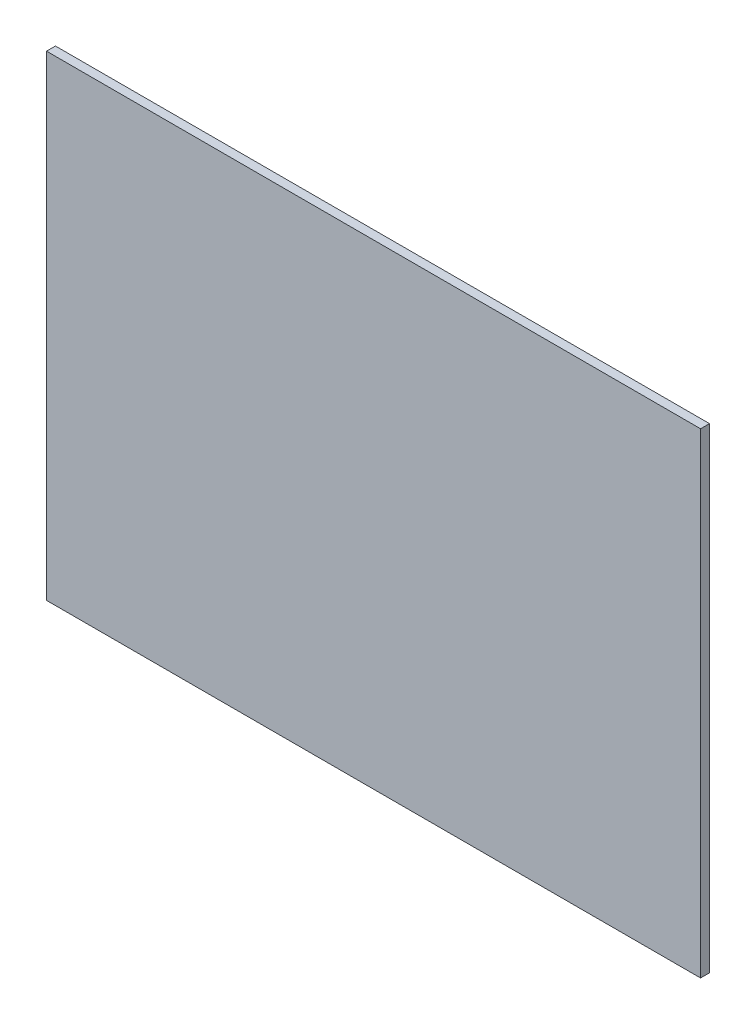
ISO-10303-21;
HEADER;
FILE_DESCRIPTION(('STEP AP214'),'2;1');
FILE_NAME('part.step','',(''),(''),'','','');
FILE_SCHEMA(('AUTOMOTIVE_DESIGN { 1 0 10303 214 1 1 1 1 }'));
ENDSEC;
DATA;
#1=APPLICATION_CONTEXT('core data for automotive mechanical design processes');
#2=APPLICATION_PROTOCOL_DEFINITION('international standard','automotive_design',2000,#1);
#3=PRODUCT_CONTEXT('',#1,'mechanical');
#4=PRODUCT('Part','Part','',(#3));
#5=PRODUCT_RELATED_PRODUCT_CATEGORY('part','',(#4));
#6=PRODUCT_DEFINITION_FORMATION('','',#4);
#7=PRODUCT_DEFINITION_CONTEXT('part definition',#1,'design');
#8=PRODUCT_DEFINITION('design','',#6,#7);
#9=PRODUCT_DEFINITION_SHAPE('','',#8);
#10=(LENGTH_UNIT() NAMED_UNIT(*) SI_UNIT(.MILLI.,.METRE.));
#11=(NAMED_UNIT(*) PLANE_ANGLE_UNIT() SI_UNIT($,.RADIAN.));
#12=(NAMED_UNIT(*) SI_UNIT($,.STERADIAN.) SOLID_ANGLE_UNIT());
#13=UNCERTAINTY_MEASURE_WITH_UNIT(LENGTH_MEASURE(1.E-05),#10,'distance_accuracy_value','');
#14=(GEOMETRIC_REPRESENTATION_CONTEXT(3) GLOBAL_UNCERTAINTY_ASSIGNED_CONTEXT((#13)) GLOBAL_UNIT_ASSIGNED_CONTEXT((#10,
#11,#12)) REPRESENTATION_CONTEXT('',''));
#15=CARTESIAN_POINT('',(0.,0.,0.));
#16=DIRECTION('',(0.,0.,1.));
#17=DIRECTION('',(1.,0.,0.));
#18=AXIS2_PLACEMENT_3D('',#15,#16,#17);
#19=CARTESIAN_POINT('',(0.,0.,1.5));
#20=DIRECTION('',(-1.,0.,0.));
#21=DIRECTION('',(0.,0.,1.));
#22=AXIS2_PLACEMENT_3D('',#19,#20,#21);
#23=PLANE('',#22);
#24=DIRECTION('',(0.,1.,0.));
#25=VECTOR('',#24,1.);
#26=CARTESIAN_POINT('',(0.,0.,0.));
#27=LINE('',#26,#25);
#28=CARTESIAN_POINT('',(0.,0.,0.));
#29=VERTEX_POINT('',#28);
#30=CARTESIAN_POINT('',(0.,80.,0.));
#31=VERTEX_POINT('',#30);
#32=EDGE_CURVE('E96',#29,#31,#27,.T.);
#33=ORIENTED_EDGE('',*,*,#32,.T.);
#34=DIRECTION('',(0.,0.,-1.));
#35=VECTOR('',#34,1.);
#36=CARTESIAN_POINT('',(0.,80.,1.5));
#37=LINE('',#36,#35);
#38=CARTESIAN_POINT('',(0.,80.,1.5));
#39=VERTEX_POINT('',#38);
#40=EDGE_CURVE('E11',#39,#31,#37,.T.);
#41=ORIENTED_EDGE('',*,*,#40,.F.);
#42=DIRECTION('',(0.,1.,0.));
#43=VECTOR('',#42,1.);
#44=CARTESIAN_POINT('',(0.,0.,1.5));
#45=LINE('',#44,#43);
#46=CARTESIAN_POINT('',(0.,0.,1.5));
#47=VERTEX_POINT('',#46);
#48=EDGE_CURVE('E84',#47,#39,#45,.T.);
#49=ORIENTED_EDGE('',*,*,#48,.F.);
#50=DIRECTION('',(0.,0.,-1.));
#51=VECTOR('',#50,1.);
#52=CARTESIAN_POINT('',(0.,0.,1.5));
#53=LINE('',#52,#51);
#54=EDGE_CURVE('E92',#47,#29,#53,.T.);
#55=ORIENTED_EDGE('',*,*,#54,.T.);
#56=EDGE_LOOP('',(#33,#41,#49,#55));
#57=FACE_BOUND('',#56,.T.);
#58=ADVANCED_FACE('F33',(#57),#23,.F.);
#59=CARTESIAN_POINT('',(0.,80.,1.5));
#60=DIRECTION('',(0.,-1.,0.));
#61=DIRECTION('',(1.,0.,0.));
#62=AXIS2_PLACEMENT_3D('',#59,#60,#61);
#63=PLANE('',#62);
#64=DIRECTION('',(-1.,0.,0.));
#65=VECTOR('',#64,1.);
#66=CARTESIAN_POINT('',(0.,80.,0.));
#67=LINE('',#66,#65);
#68=CARTESIAN_POINT('',(-110.,80.,0.));
#69=VERTEX_POINT('',#68);
#70=EDGE_CURVE('E88',#31,#69,#67,.T.);
#71=ORIENTED_EDGE('',*,*,#70,.T.);
#72=DIRECTION('',(0.,0.,-1.));
#73=VECTOR('',#72,1.);
#74=CARTESIAN_POINT('',(-110.,80.,1.5));
#75=LINE('',#74,#73);
#76=CARTESIAN_POINT('',(-110.,80.,1.5));
#77=VERTEX_POINT('',#76);
#78=EDGE_CURVE('E41',#77,#69,#75,.T.);
#79=ORIENTED_EDGE('',*,*,#78,.F.);
#80=DIRECTION('',(-1.,0.,0.));
#81=VECTOR('',#80,1.);
#82=CARTESIAN_POINT('',(0.,80.,1.5));
#83=LINE('',#82,#81);
#84=EDGE_CURVE('E79',#39,#77,#83,.T.);
#85=ORIENTED_EDGE('',*,*,#84,.F.);
#86=ORIENTED_EDGE('',*,*,#40,.T.);
#87=EDGE_LOOP('',(#71,#79,#85,#86));
#88=FACE_BOUND('',#87,.T.);
#89=ADVANCED_FACE('F87',(#88),#63,.F.);
#90=CARTESIAN_POINT('',(-110.,0.,1.5));
#91=DIRECTION('',(1.,0.,0.));
#92=DIRECTION('',(0.,0.,-1.));
#93=AXIS2_PLACEMENT_3D('',#90,#91,#92);
#94=PLANE('',#93);
#95=DIRECTION('',(0.,-1.,0.));
#96=VECTOR('',#95,1.);
#97=CARTESIAN_POINT('',(-110.,0.,0.));
#98=LINE('',#97,#96);
#99=CARTESIAN_POINT('',(-110.,0.,0.));
#100=VERTEX_POINT('',#99);
#101=EDGE_CURVE('E66',#69,#100,#98,.T.);
#102=ORIENTED_EDGE('',*,*,#101,.T.);
#103=DIRECTION('',(0.,0.,-1.));
#104=VECTOR('',#103,1.);
#105=CARTESIAN_POINT('',(-110.,0.,1.5));
#106=LINE('',#105,#104);
#107=CARTESIAN_POINT('',(-110.,0.,1.5));
#108=VERTEX_POINT('',#107);
#109=EDGE_CURVE('E89',#108,#100,#106,.T.);
#110=ORIENTED_EDGE('',*,*,#109,.F.);
#111=DIRECTION('',(0.,-1.,0.));
#112=VECTOR('',#111,1.);
#113=CARTESIAN_POINT('',(-110.,0.,1.5));
#114=LINE('',#113,#112);
#115=EDGE_CURVE('E82',#77,#108,#114,.T.);
#116=ORIENTED_EDGE('',*,*,#115,.F.);
#117=ORIENTED_EDGE('',*,*,#78,.T.);
#118=EDGE_LOOP('',(#102,#110,#116,#117));
#119=FACE_BOUND('',#118,.T.);
#120=ADVANCED_FACE('F90',(#119),#94,.F.);
#121=CARTESIAN_POINT('',(0.,0.,1.5));
#122=DIRECTION('',(0.,1.,0.));
#123=DIRECTION('',(-1.,0.,0.));
#124=AXIS2_PLACEMENT_3D('',#121,#122,#123);
#125=PLANE('',#124);
#126=DIRECTION('',(1.,0.,0.));
#127=VECTOR('',#126,1.);
#128=CARTESIAN_POINT('',(0.,0.,0.));
#129=LINE('',#128,#127);
#130=EDGE_CURVE('E72',#100,#29,#129,.T.);
#131=ORIENTED_EDGE('',*,*,#130,.T.);
#132=ORIENTED_EDGE('',*,*,#54,.F.);
#133=DIRECTION('',(1.,0.,0.));
#134=VECTOR('',#133,1.);
#135=CARTESIAN_POINT('',(0.,0.,1.5));
#136=LINE('',#135,#134);
#137=EDGE_CURVE('E49',#108,#47,#136,.T.);
#138=ORIENTED_EDGE('',*,*,#137,.F.);
#139=ORIENTED_EDGE('',*,*,#109,.T.);
#140=EDGE_LOOP('',(#131,#132,#138,#139));
#141=FACE_BOUND('',#140,.T.);
#142=ADVANCED_FACE('F103',(#141),#125,.F.);
#143=CARTESIAN_POINT('',(0.,0.,1.5));
#144=DIRECTION('',(0.,0.,1.));
#145=DIRECTION('',(1.,0.,0.));
#146=AXIS2_PLACEMENT_3D('',#143,#144,#145);
#147=PLANE('',#146);
#148=ORIENTED_EDGE('',*,*,#48,.T.);
#149=ORIENTED_EDGE('',*,*,#84,.T.);
#150=ORIENTED_EDGE('',*,*,#115,.T.);
#151=ORIENTED_EDGE('',*,*,#137,.T.);
#152=EDGE_LOOP('',(#148,#149,#150,#151));
#153=FACE_BOUND('',#152,.T.);
#154=ADVANCED_FACE('F80',(#153),#147,.T.);
#155=CARTESIAN_POINT('',(0.,0.,0.));
#156=DIRECTION('',(0.,0.,1.));
#157=DIRECTION('',(1.,0.,0.));
#158=AXIS2_PLACEMENT_3D('',#155,#156,#157);
#159=PLANE('',#158);
#160=ORIENTED_EDGE('',*,*,#32,.F.);
#161=ORIENTED_EDGE('',*,*,#130,.F.);
#162=ORIENTED_EDGE('',*,*,#101,.F.);
#163=ORIENTED_EDGE('',*,*,#70,.F.);
#164=EDGE_LOOP('',(#160,#161,#162,#163));
#165=FACE_BOUND('',#164,.T.);
#166=ADVANCED_FACE('F106',(#165),#159,.F.);
#167=CLOSED_SHELL('',(#58,#89,#120,#142,#154,#166));
#168=MANIFOLD_SOLID_BREP('B2',#167);
#169=ADVANCED_BREP_SHAPE_REPRESENTATION('',(#18,#168),#14);
#170=SHAPE_DEFINITION_REPRESENTATION(#9,#169);
ENDSEC;
END-ISO-10303-21;
